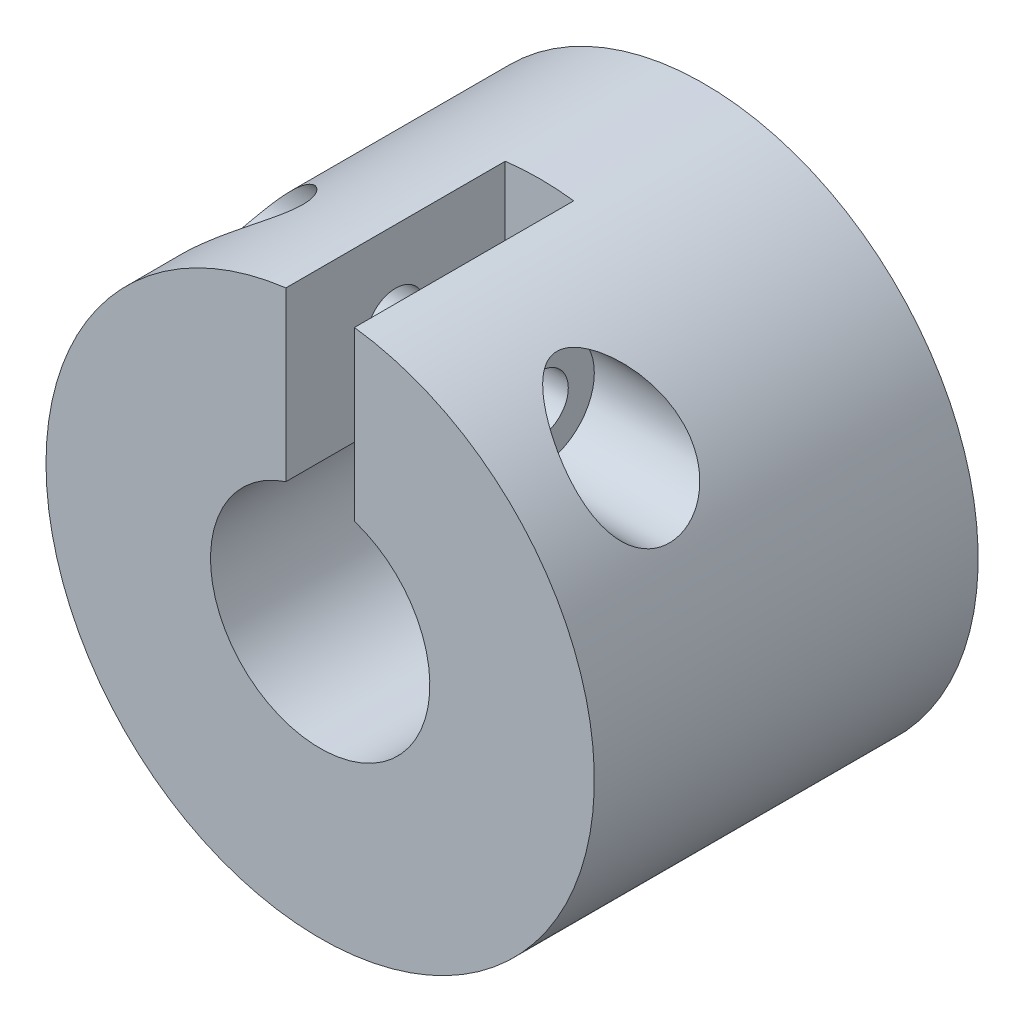
ISO-10303-21;
HEADER;
FILE_DESCRIPTION(('STEP AP214'),'2;1');
FILE_NAME('part.step','',(''),(''),'','','');
FILE_SCHEMA(('AUTOMOTIVE_DESIGN { 1 0 10303 214 1 1 1 1 }'));
ENDSEC;
DATA;
#1=APPLICATION_CONTEXT('core data for automotive mechanical design processes');
#2=APPLICATION_PROTOCOL_DEFINITION('international standard','automotive_design',2000,#1);
#3=PRODUCT_CONTEXT('',#1,'mechanical');
#4=PRODUCT('Part','Part','',(#3));
#5=PRODUCT_RELATED_PRODUCT_CATEGORY('part','',(#4));
#6=PRODUCT_DEFINITION_FORMATION('','',#4);
#7=PRODUCT_DEFINITION_CONTEXT('part definition',#1,'design');
#8=PRODUCT_DEFINITION('design','',#6,#7);
#9=PRODUCT_DEFINITION_SHAPE('','',#8);
#10=(LENGTH_UNIT() NAMED_UNIT(*) SI_UNIT(.MILLI.,.METRE.));
#11=(NAMED_UNIT(*) PLANE_ANGLE_UNIT() SI_UNIT($,.RADIAN.));
#12=(NAMED_UNIT(*) SI_UNIT($,.STERADIAN.) SOLID_ANGLE_UNIT());
#13=UNCERTAINTY_MEASURE_WITH_UNIT(LENGTH_MEASURE(1.E-05),#10,'distance_accuracy_value','');
#14=(GEOMETRIC_REPRESENTATION_CONTEXT(3) GLOBAL_UNCERTAINTY_ASSIGNED_CONTEXT((#13)) GLOBAL_UNIT_ASSIGNED_CONTEXT((#10,
#11,#12)) REPRESENTATION_CONTEXT('',''));
#15=CARTESIAN_POINT('',(0.,0.,0.));
#16=DIRECTION('',(0.,0.,1.));
#17=DIRECTION('',(1.,0.,0.));
#18=AXIS2_PLACEMENT_3D('',#15,#16,#17);
#19=CARTESIAN_POINT('',(0.,0.,8.));
#20=DIRECTION('',(0.,0.,-1.));
#21=DIRECTION('',(-1.,0.,0.));
#22=AXIS2_PLACEMENT_3D('',#19,#20,#21);
#23=CYLINDRICAL_SURFACE('',#22,10.);
#24=CARTESIAN_POINT('',(0.,0.,8.));
#25=DIRECTION('',(0.,0.,1.));
#26=DIRECTION('',(1.,0.,0.));
#27=AXIS2_PLACEMENT_3D('',#24,#25,#26);
#28=CIRCLE('',#27,10.);
#29=CARTESIAN_POINT('',(-1.25,9.92156741649221,8.));
#30=VERTEX_POINT('',#29);
#31=CARTESIAN_POINT('',(1.25,9.92156741649221,8.));
#32=VERTEX_POINT('',#31);
#33=EDGE_CURVE('E123',#30,#32,#28,.T.);
#34=ORIENTED_EDGE('',*,*,#33,.F.);
#35=DIRECTION('',(0.,0.,-1.));
#36=VECTOR('',#35,1.);
#37=CARTESIAN_POINT('',(-1.25,9.92156741649221,8.));
#38=LINE('',#37,#36);
#39=CARTESIAN_POINT('',(-1.25,9.92156741649221,0.));
#40=VERTEX_POINT('',#39);
#41=EDGE_CURVE('E85',#30,#40,#38,.T.);
#42=ORIENTED_EDGE('',*,*,#41,.T.);
#43=CARTESIAN_POINT('',(0.,0.,0.));
#44=DIRECTION('',(0.,0.,-1.));
#45=DIRECTION('',(-1.,0.,0.));
#46=AXIS2_PLACEMENT_3D('',#43,#44,#45);
#47=CIRCLE('',#46,10.);
#48=CARTESIAN_POINT('',(1.25,9.92156741649221,0.));
#49=VERTEX_POINT('',#48);
#50=EDGE_CURVE('E92',#40,#49,#47,.T.);
#51=ORIENTED_EDGE('',*,*,#50,.T.);
#52=DIRECTION('',(0.,0.,-1.));
#53=VECTOR('',#52,1.);
#54=CARTESIAN_POINT('',(1.25,9.92156741649221,8.));
#55=LINE('',#54,#53);
#56=EDGE_CURVE('E77',#49,#32,#55,.F.);
#57=ORIENTED_EDGE('',*,*,#56,.T.);
#58=EDGE_LOOP('',(#34,#42,#51,#57));
#59=FACE_BOUND('',#58,.T.);
#60=CARTESIAN_POINT('',(-7.27543152095098,6.86061922744244,6.));
#61=CARTESIAN_POINT('',(-7.39183216666685,6.73719001609119,5.99999880292958));
#62=CARTESIAN_POINT('',(-7.50505648529488,6.61078459610578,5.98860999962556));
#63=CARTESIAN_POINT('',(-7.72254321051827,6.35533309906759,5.93946749641221));
#64=CARTESIAN_POINT('',(-7.82681943364679,6.22629148839569,5.90175529543701));
#65=CARTESIAN_POINT('',(-8.00052633292854,6.00058287395714,5.80875583795577));
#66=CARTESIAN_POINT('',(-8.07243952590286,5.90332827451924,5.75954739046856));
#67=CARTESIAN_POINT('',(-8.20753974351116,5.71399822557016,5.64244533449945));
#68=CARTESIAN_POINT('',(-8.27072926490819,5.62192129867063,5.57455708899766));
#69=CARTESIAN_POINT('',(-8.38721839858168,5.44662787246044,5.41931003595386));
#70=CARTESIAN_POINT('',(-8.44043104736862,5.36349175571951,5.33179342106205));
#71=CARTESIAN_POINT('',(-8.5347366942598,5.21212548794851,5.13905001145749));
#72=CARTESIAN_POINT('',(-8.57583997831625,5.1438826990573,5.03383836732313));
#73=CARTESIAN_POINT('',(-8.63996394592979,5.03532039607679,4.82473340756291));
#74=CARTESIAN_POINT('',(-8.66470527480826,4.99243629036043,4.72269519029521));
#75=CARTESIAN_POINT('',(-8.70386555798854,4.92385067968516,4.51113795623102));
#76=CARTESIAN_POINT('',(-8.7182913728946,4.8981377553336,4.40162396459485));
#77=CARTESIAN_POINT('',(-8.73564183749775,4.86711803246507,4.19025966301935));
#78=CARTESIAN_POINT('',(-8.73958051168062,4.86001328420116,4.08875174061526));
#79=CARTESIAN_POINT('',(-8.73886217900801,4.86130561508796,3.88587988197227));
#80=CARTESIAN_POINT('',(-8.73420771331676,4.86969811139202,3.78451591203466));
#81=CARTESIAN_POINT('',(-8.71663850571998,4.90107295256313,3.58793652215147));
#82=CARTESIAN_POINT('',(-8.70397241014255,4.92361597145719,3.49262791507788));
#83=CARTESIAN_POINT('',(-8.67079643808582,4.98180716428413,3.30755816173122));
#84=CARTESIAN_POINT('',(-8.65028643315122,5.01745555283591,3.21779710633525));
#85=CARTESIAN_POINT('',(-8.60114356580542,5.1012481056407,3.04388518966525));
#86=CARTESIAN_POINT('',(-8.57232582614404,5.14967426722744,2.95992310357321));
#87=CARTESIAN_POINT('',(-8.50727352508103,5.25644345332605,2.80177965935134));
#88=CARTESIAN_POINT('',(-8.47103719894153,5.3147888368674,2.72760063533834));
#89=CARTESIAN_POINT('',(-8.38868662329482,5.44391659803161,2.58475176376587));
#90=CARTESIAN_POINT('',(-8.34202421011732,5.51531261986942,2.51695548977554));
#91=CARTESIAN_POINT('',(-8.2417066216192,5.66412706703188,2.39447541805159));
#92=CARTESIAN_POINT('',(-8.18804864450139,5.74154790032197,2.33979689917217));
#93=CARTESIAN_POINT('',(-8.06680793836133,5.91091158695257,2.23670798933786));
#94=CARTESIAN_POINT('',(-7.99832626083275,6.00337810261382,2.19022239691934));
#95=CARTESIAN_POINT('',(-7.8549069894382,6.18985754650653,2.11312946552314));
#96=CARTESIAN_POINT('',(-7.7799649618021,6.2838715003691,2.08253313422488));
#97=CARTESIAN_POINT('',(-7.58486284683145,6.51948296795391,2.02388701408774));
#98=CARTESIAN_POINT('',(-7.46130241506478,6.66063505810728,2.00527474144647));
#99=CARTESIAN_POINT('',(-7.20581814101485,6.93626074245709,1.99665832412566));
#100=CARTESIAN_POINT('',(-7.07387557741066,7.07071809856324,2.00672058882349));
#101=CARTESIAN_POINT('',(-6.85385424612593,7.28277898270894,2.04327386910868));
#102=CARTESIAN_POINT('',(-6.76725032482597,7.36329413775669,2.06247011589135));
#103=CARTESIAN_POINT('',(-6.59266712487456,7.52000542047024,2.11004846762096));
#104=CARTESIAN_POINT('',(-6.50468794735249,7.59620186382386,2.13842990013185));
#105=CARTESIAN_POINT('',(-6.32797219058987,7.7440339171993,2.20385938559858));
#106=CARTESIAN_POINT('',(-6.23923490022363,7.81566454799107,2.24091670102443));
#107=CARTESIAN_POINT('',(-6.06186839405526,7.95401705165172,2.323405682498));
#108=CARTESIAN_POINT('',(-5.97323915055741,8.02074071461028,2.36883427324147));
#109=CARTESIAN_POINT('',(-5.82093233316387,8.13160861110573,2.45466024584472));
#110=CARTESIAN_POINT('',(-5.75701280247679,8.17696518508571,2.49307549913814));
#111=CARTESIAN_POINT('',(-5.63018553203752,8.2648021802,2.57456666985809));
#112=CARTESIAN_POINT('',(-5.56727757162637,8.30728323525719,2.61764155456902));
#113=CARTESIAN_POINT('',(-5.44325193757311,8.38907085704258,2.7086555894336));
#114=CARTESIAN_POINT('',(-5.38212987099805,8.42838572126824,2.7565812296204));
#115=CARTESIAN_POINT('',(-5.26241494451332,8.50364503971121,2.857876321276));
#116=CARTESIAN_POINT('',(-5.20382037964374,8.53959178574889,2.91124201869281));
#117=CARTESIAN_POINT('',(-5.09135066981113,8.6071121034955,3.02328284781613));
#118=CARTESIAN_POINT('',(-5.03741528084065,8.63874614192877,3.08186002268785));
#119=CARTESIAN_POINT('',(-4.9352330074264,8.69752468407302,3.20596563770282));
#120=CARTESIAN_POINT('',(-4.88698449158852,8.72467047623227,3.27149207401285));
#121=CARTESIAN_POINT('',(-4.80778423369589,8.76851523101797,3.39711327154679));
#122=CARTESIAN_POINT('',(-4.77528846180273,8.7862191922746,3.45586381121272));
#123=CARTESIAN_POINT('',(-4.71874981195852,8.81671343947372,3.57850146569843));
#124=CARTESIAN_POINT('',(-4.69468828087458,8.82951457437493,3.6423768566815));
#125=CARTESIAN_POINT('',(-4.6619678195133,8.84682567363886,3.75980762148474));
#126=CARTESIAN_POINT('',(-4.65108903689967,8.85253783427644,3.81255701477843));
#127=CARTESIAN_POINT('',(-4.63741763866107,8.85970775261065,3.91937193645345));
#128=CARTESIAN_POINT('',(-4.63461758699835,8.86116942266524,3.97343620829709));
#129=CARTESIAN_POINT('',(-4.63743630798052,8.85969445490552,4.08130390673292));
#130=CARTESIAN_POINT('',(-4.64305939651356,8.85675556231055,4.13510718542262));
#131=CARTESIAN_POINT('',(-4.66206068618562,8.84676782251377,4.24093371112833));
#132=CARTESIAN_POINT('',(-4.67544707237924,8.83971463745632,4.29295501796186));
#133=CARTESIAN_POINT('',(-4.7148687344645,8.81876812838903,4.41307166023));
#134=CARTESIAN_POINT('',(-4.74375748398599,8.80330599591419,4.47994299706321));
#135=CARTESIAN_POINT('',(-4.81014469132421,8.76720774712063,4.60775176506861));
#136=CARTESIAN_POINT('',(-4.84766552532873,8.74655817083267,4.66867317770388));
#137=CARTESIAN_POINT('',(-4.9227311016886,8.70449887180195,4.77650297520663));
#138=CARTESIAN_POINT('',(-4.95950596515958,8.68361961513199,4.82416969561761));
#139=CARTESIAN_POINT('',(-5.03616229613354,8.63938866945012,4.91573090318414));
#140=CARTESIAN_POINT('',(-5.07604604330404,8.61603516153705,4.95962257162841));
#141=CARTESIAN_POINT('',(-5.19917382986714,8.54269707640285,5.08636442314892));
#142=CARTESIAN_POINT('',(-5.28576966482311,8.48950374398807,5.16411426569945));
#143=CARTESIAN_POINT('',(-5.45270465371394,8.38311656890292,5.29940439840398));
#144=CARTESIAN_POINT('',(-5.53252097610051,8.33071212099053,5.35825279372511));
#145=CARTESIAN_POINT('',(-5.69425819950565,8.22100770903411,5.46811858769752));
#146=CARTESIAN_POINT('',(-5.776180521172,8.16370437633948,5.51913052919628));
#147=CARTESIAN_POINT('',(-5.94101681247281,8.04454311223088,5.61372536677045));
#148=CARTESIAN_POINT('',(-6.02393107351422,7.98268381342834,5.65730601936481));
#149=CARTESIAN_POINT('',(-6.18998066254687,7.85462530485055,5.73713722662758));
#150=CARTESIAN_POINT('',(-6.27311605038944,7.78842477364789,5.77338553556152));
#151=CARTESIAN_POINT('',(-6.43482067892143,7.65529154330261,5.83675082282698));
#152=CARTESIAN_POINT('',(-6.51341128564333,7.58855918811224,5.8642324194556));
#153=CARTESIAN_POINT('',(-6.66969436793238,7.4515779572562,5.91207612815487));
#154=CARTESIAN_POINT('',(-6.74738654495358,7.38132795180029,5.93243593588216));
#155=CARTESIAN_POINT('',(-6.97815392381971,7.16584749710413,5.98205427770373));
#156=CARTESIAN_POINT('',(-7.1292959276183,7.01557885781622,6.0000015028662));
#157=CARTESIAN_POINT('',(-7.27543152095098,6.86061922744244,6.));
#158=B_SPLINE_CURVE_WITH_KNOTS('',3,(#60,#61,#62,#63,#64,#65,#66,#67,#68,#69,#70,#71,#72,#73,
#74,#75,#76,#77,#78,#79,#80,#81,#82,#83,#84,#85,#86,#87,#88,#89,#90,#91,#92,#93,#94,#95,#96,#97,
#98,#99,#100,#101,#102,#103,#104,#105,#106,#107,#108,#109,#110,#111,#112,#113,#114,#115,#116,
#117,#118,#119,#120,#121,#122,#123,#124,#125,#126,#127,#128,#129,#130,#131,#132,#133,#134,#135,
#136,#137,#138,#139,#140,#141,#142,#143,#144,#145,#146,#147,#148,#149,#150,#151,#152,#153,#154,
#155,#156,#157),.UNSPECIFIED.,.T.,.F.,(4,2,2,2,2,2,2,2,2,2,2,2,2,2,2,2,2,2,2,2,2,2,2,2,2,2,2,2,
2,2,2,2,2,2,2,2,2,2,2,2,2,2,2,2,2,2,2,2,4),(0.,0.508402815212956,1.01600593644292,
1.40625688016514,1.79639589932578,2.18979176005942,2.5828524920917,2.92119971073322,
3.2593216928226,3.56331049974366,3.86720942546145,4.16211066100965,4.45701672619638,
4.75907257224348,5.06120035518265,5.38676212684573,5.71245469231621,6.08337428835854,
6.45455050649949,7.01700378322203,7.58076074295556,7.93974952649931,8.29871203486195,
8.65805953741822,9.01727529090553,9.27897388033132,9.54061458778853,9.80154566069195,
10.0622978748824,10.3189024375739,10.575433207986,10.7830819344418,10.9902684845688,
11.1520514313027,11.3136854179468,11.4754022517058,11.6372898986697,11.8594327901584,
12.082158143971,12.2730504173388,12.4640840084327,12.8468033295066,13.1829016265545,
13.5192329250974,13.8556655818437,14.1922011249618,14.5119908917459,14.8318840349817,
15.470160108076),.UNSPECIFIED.);
#159=CARTESIAN_POINT('',(-7.27543152095098,6.86061922744244,6.));
#160=VERTEX_POINT('',#159);
#161=EDGE_CURVE('E129',#160,#160,#158,.T.);
#162=ORIENTED_EDGE('',*,*,#161,.T.);
#163=EDGE_LOOP('',(#162));
#164=FACE_BOUND('',#163,.T.);
#165=CARTESIAN_POINT('',(7.27543152095098,6.86061922744244,2.));
#166=CARTESIAN_POINT('',(7.19973494617591,6.94089639404656,2.00000134650425));
#167=CARTESIAN_POINT('',(7.12274072780046,7.01987603436354,2.00482630472186));
#168=CARTESIAN_POINT('',(6.96671784168169,7.17474115731961,2.02328339309686));
#169=CARTESIAN_POINT('',(6.8876891420166,7.25062659136112,2.03691566152522));
#170=CARTESIAN_POINT('',(6.72799032223454,7.39905848508546,2.07232773928204));
#171=CARTESIAN_POINT('',(6.64731667335451,7.47159636299777,2.09412731015141));
#172=CARTESIAN_POINT('',(6.48507049540748,7.61284619383213,2.14533089686928));
#173=CARTESIAN_POINT('',(6.40349809468315,7.68155868475384,2.17473384008489));
#174=CARTESIAN_POINT('',(6.23822794339106,7.81640143925017,2.24151633762111));
#175=CARTESIAN_POINT('',(6.15452248769714,7.8824432993419,2.27905515465465));
#176=CARTESIAN_POINT('',(5.98741677063869,8.01011190896215,2.36157235039098));
#177=CARTESIAN_POINT('',(5.90401649002242,8.07173894171743,2.40655025123665));
#178=CARTESIAN_POINT('',(5.73863878146853,8.19013605383186,2.50392453879768));
#179=CARTESIAN_POINT('',(5.65665735758223,8.24692257677824,2.5562940614693));
#180=CARTESIAN_POINT('',(5.49500028866592,8.35550290189973,2.66904175588181));
#181=CARTESIAN_POINT('',(5.41532270025797,8.40730100340739,2.72941292269848));
#182=CARTESIAN_POINT('',(5.27412651078103,8.4964250092309,2.84736749548459));
#183=CARTESIAN_POINT('',(5.21194403056898,8.53466835861574,2.90345532812448));
#184=CARTESIAN_POINT('',(5.09168599161189,8.60695374511315,3.02266528550804));
#185=CARTESIAN_POINT('',(5.03361718166699,8.64098894360833,3.08579855104407));
#186=CARTESIAN_POINT('',(4.92350296168051,8.7042051684188,3.22099539638004));
#187=CARTESIAN_POINT('',(4.87154312548135,8.73331927782759,3.29316192559384));
#188=CARTESIAN_POINT('',(4.77904872627515,8.78427407702013,3.44680235721327));
#189=CARTESIAN_POINT('',(4.73846474332665,8.80614630516552,3.52823376979113));
#190=CARTESIAN_POINT('',(4.68800483308607,8.83306745625777,3.66509601239881));
#191=CARTESIAN_POINT('',(4.6723469440356,8.84134304089603,3.7177375479662));
#192=CARTESIAN_POINT('',(4.64889327304269,8.85369809517565,3.82521510174499));
#193=CARTESIAN_POINT('',(4.64108693971214,8.85778319638551,3.88004807160003));
#194=CARTESIAN_POINT('',(4.63424486925248,8.86136519921055,3.99066104365043));
#195=CARTESIAN_POINT('',(4.63524622204878,8.86084269779024,4.04644406248887));
#196=CARTESIAN_POINT('',(4.64597430494869,8.85522191944402,4.15693721983275));
#197=CARTESIAN_POINT('',(4.65570853766152,8.85011970798654,4.21164639446758));
#198=CARTESIAN_POINT('',(4.68570897413174,8.83427813350283,4.33011424350322));
#199=CARTESIAN_POINT('',(4.7077977930397,8.82255817993973,4.39327078156419));
#200=CARTESIAN_POINT('',(4.76046194907201,8.79425360477145,4.51475373129939));
#201=CARTESIAN_POINT('',(4.7910556420502,8.77765845671067,4.57306933735816));
#202=CARTESIAN_POINT('',(4.87932763988737,8.72903247808798,4.71988657841276));
#203=CARTESIAN_POINT('',(4.94194447912354,8.69385525519776,4.80432755723853));
#204=CARTESIAN_POINT('',(5.07605999401013,8.6162454589532,4.96204380192169));
#205=CARTESIAN_POINT('',(5.14758500115424,8.5737912294769,5.03528446810437));
#206=CARTESIAN_POINT('',(5.28935898222001,8.48698991718398,5.16642127982726));
#207=CARTESIAN_POINT('',(5.35918976650726,8.44311871839884,5.22509509861754));
#208=CARTESIAN_POINT('',(5.50149755652881,8.35109072666784,5.33553945102264));
#209=CARTESIAN_POINT('',(5.5739765671316,8.30293064540193,5.38730461040353));
#210=CARTESIAN_POINT('',(5.72052160227552,8.20265359491962,5.4845273038937));
#211=CARTESIAN_POINT('',(5.79458905736133,8.15053294133597,5.52997885075874));
#212=CARTESIAN_POINT('',(5.94349823363413,8.04259235159119,5.61482248841806));
#213=CARTESIAN_POINT('',(6.01834005623065,7.98677192560595,5.65421377457401));
#214=CARTESIAN_POINT('',(6.17328131388875,7.86770402667346,5.72947041906073));
#215=CARTESIAN_POINT('',(6.25339472531127,7.8042095579694,5.76491845691361));
#216=CARTESIAN_POINT('',(6.41324938940109,7.67339125358168,5.82885272008774));
#217=CARTESIAN_POINT('',(6.49299058335808,7.60606683450334,5.85733788127419));
#218=CARTESIAN_POINT('',(6.73069324776324,7.39876528261943,5.93182682789668));
#219=CARTESIAN_POINT('',(6.88746146556546,7.25320998093408,5.96702332102869));
#220=CARTESIAN_POINT('',(7.16643347303473,6.97666718835129,6.0005960096058));
#221=CARTESIAN_POINT('',(7.28988851182624,6.84758168564246,6.00433363332952));
#222=CARTESIAN_POINT('',(7.5288086773591,6.58395635162127,5.98516179546582));
#223=CARTESIAN_POINT('',(7.64428291027328,6.44942302401222,5.96228325328596));
#224=CARTESIAN_POINT('',(7.84034628869166,6.20868105244667,5.89396448657287));
#225=CARTESIAN_POINT('',(7.92310797971224,6.10258127208799,5.85441043320633));
#226=CARTESIAN_POINT('',(8.07974264304064,5.89361696459721,5.7545002529879));
#227=CARTESIAN_POINT('',(8.15362623210733,5.79074868412124,5.69416931265917));
#228=CARTESIAN_POINT('',(8.27935194292479,5.60914565255099,5.56339929086252));
#229=CARTESIAN_POINT('',(8.33282412508591,5.52920879254374,5.49620616738128));
#230=CARTESIAN_POINT('',(8.43100063650305,5.37831977123645,5.34686200966629));
#231=CARTESIAN_POINT('',(8.47570710836021,5.30736541585057,5.26471464018713));
#232=CARTESIAN_POINT('',(8.55554984766568,5.1776852273619,5.08626149638483));
#233=CARTESIAN_POINT('',(8.59062922110976,5.11903255509662,4.98987652005452));
#234=CARTESIAN_POINT('',(8.65004722647389,5.01798256773568,4.785888984057));
#235=CARTESIAN_POINT('',(8.67439083259196,4.97557772573768,4.67829164803689));
#236=CARTESIAN_POINT('',(8.70981870359365,4.91326823466883,4.46753480738909));
#237=CARTESIAN_POINT('',(8.72204263312255,4.89144218329083,4.36513147132059));
#238=CARTESIAN_POINT('',(8.7373282060461,4.86408803950904,4.1575139431933));
#239=CARTESIAN_POINT('',(8.74039366173453,4.85855316577617,4.0523009390892));
#240=CARTESIAN_POINT('',(8.73741104926838,4.86391276022498,3.84843847330011));
#241=CARTESIAN_POINT('',(8.73187079158325,4.8738918044999,3.74975567690969));
#242=CARTESIAN_POINT('',(8.71268640546057,4.90810309597151,3.55572274701593));
#243=CARTESIAN_POINT('',(8.69904317695288,4.93233376035589,3.46037224466728));
#244=CARTESIAN_POINT('',(8.66382320325317,4.99393799843333,3.2754174055914));
#245=CARTESIAN_POINT('',(8.64223389461463,5.03133238101358,3.18582243378524));
#246=CARTESIAN_POINT('',(8.5914620609028,5.11754557325607,3.01466639493512));
#247=CARTESIAN_POINT('',(8.5622783959149,5.16636609787406,2.93310653649926));
#248=CARTESIAN_POINT('',(8.49504787777861,5.2762212216001,2.77550273800899));
#249=CARTESIAN_POINT('',(8.45661217054361,5.33776734941989,2.69998290441297));
#250=CARTESIAN_POINT('',(8.37255253262745,5.46867588617348,2.56067979636582));
#251=CARTESIAN_POINT('',(8.32692637493193,5.53804071480068,2.49690017138498));
#252=CARTESIAN_POINT('',(8.22387347363737,5.69009857252572,2.37507159444505));
#253=CARTESIAN_POINT('',(8.16569941604283,5.77341686558271,2.31843995453477));
#254=CARTESIAN_POINT('',(8.04263396162134,5.94366165990226,2.21986349552312));
#255=CARTESIAN_POINT('',(7.97773800953098,6.03059058378657,2.17792872161239));
#256=CARTESIAN_POINT('',(7.81373513329744,6.24261157391363,2.09316111140346));
#257=CARTESIAN_POINT('',(7.71175058552018,6.36832359697195,2.05742135772287));
#258=CARTESIAN_POINT('',(7.49930076433551,6.61720362265489,2.01081960395504));
#259=CARTESIAN_POINT('',(7.38882202522537,6.74036717601199,1.99999798298936));
#260=CARTESIAN_POINT('',(7.27543152095098,6.86061922744244,2.));
#261=B_SPLINE_CURVE_WITH_KNOTS('',3,(#165,#166,#167,#168,#169,#170,#171,#172,#173,#174,#175,
#176,#177,#178,#179,#180,#181,#182,#183,#184,#185,#186,#187,#188,#189,#190,#191,#192,#193,#194,
#195,#196,#197,#198,#199,#200,#201,#202,#203,#204,#205,#206,#207,#208,#209,#210,#211,#212,#213,
#214,#215,#216,#217,#218,#219,#220,#221,#222,#223,#224,#225,#226,#227,#228,#229,#230,#231,#232,
#233,#234,#235,#236,#237,#238,#239,#240,#241,#242,#243,#244,#245,#246,#247,#248,#249,#250,#251,
#252,#253,#254,#255,#256,#257,#258,#259,#260),.UNSPECIFIED.,.T.,.F.,(4,2,2,2,2,2,2,2,2,2,2,2,2,
2,2,2,2,2,2,2,2,2,2,2,2,2,2,2,2,2,2,2,2,2,2,2,2,2,2,2,2,2,2,2,2,2,2,4),(0.,0.330820714819017,
0.66164662350692,0.993278220501636,1.32486305862882,1.66364406982851,2.00240332753086,
2.33996167171592,2.67722643345081,2.95305259220192,3.22932126027546,3.50908787996453,
3.78761958072106,3.95360613685957,4.11936933113854,4.28583090162757,4.45243562000987,
4.65507621698901,4.85815760969087,5.18886245240262,5.52056911329618,5.8237812246794,
6.12722784627379,6.43096029216258,6.73473303074766,7.05900506354794,7.38332662382546,
8.03065680036246,8.56481595695254,9.09835521184058,9.51754847812719,9.93623536098249,
10.2867410086832,10.6371608752493,10.9896091092889,11.3418938716486,11.6565005698093,
11.9709762919583,12.2675879198931,12.5641666117893,12.861216249101,13.158310499375,
13.4712065136753,13.7841996287564,14.131862200882,14.4797619362944,14.9745172358437,
15.4700737096895),.UNSPECIFIED.);
#262=CARTESIAN_POINT('',(7.27543152095098,6.86061922744244,2.));
#263=VERTEX_POINT('',#262);
#264=EDGE_CURVE('E37',#263,#263,#261,.T.);
#265=ORIENTED_EDGE('',*,*,#264,.F.);
#266=EDGE_LOOP('',(#265));
#267=FACE_BOUND('',#266,.T.);
#268=CARTESIAN_POINT('',(0.,0.,-6.));
#269=DIRECTION('',(0.,0.,-1.));
#270=DIRECTION('',(-1.,0.,0.));
#271=AXIS2_PLACEMENT_3D('',#268,#269,#270);
#272=CIRCLE('',#271,10.);
#273=CARTESIAN_POINT('',(-10.,0.,-6.));
#274=VERTEX_POINT('',#273);
#275=EDGE_CURVE('E99',#274,#274,#272,.T.);
#276=ORIENTED_EDGE('',*,*,#275,.F.);
#277=EDGE_LOOP('',(#276));
#278=FACE_BOUND('',#277,.T.);
#279=ADVANCED_FACE('F33',(#59,#164,#267,#278),#23,.T.);
#280=CARTESIAN_POINT('',(10.,6.86061922744244,4.));
#281=DIRECTION('',(-1.,0.,0.));
#282=DIRECTION('',(0.,0.,1.));
#283=AXIS2_PLACEMENT_3D('',#280,#281,#282);
#284=CYLINDRICAL_SURFACE('',#283,1.05);
#285=CARTESIAN_POINT('',(1.25,6.86061922744244,4.));
#286=DIRECTION('',(1.,0.,0.));
#287=DIRECTION('',(0.,0.,-1.));
#288=AXIS2_PLACEMENT_3D('',#285,#286,#287);
#289=CIRCLE('',#288,1.05);
#290=CARTESIAN_POINT('',(1.25,6.86061922744244,2.95));
#291=VERTEX_POINT('',#290);
#292=EDGE_CURVE('E112',#291,#291,#289,.T.);
#293=ORIENTED_EDGE('',*,*,#292,.F.);
#294=EDGE_LOOP('',(#293));
#295=FACE_BOUND('',#294,.T.);
#296=CARTESIAN_POINT('',(4.,6.86061922744244,4.));
#297=DIRECTION('',(1.,0.,0.));
#298=DIRECTION('',(0.,0.,-1.));
#299=AXIS2_PLACEMENT_3D('',#296,#297,#298);
#300=CIRCLE('',#299,1.05);
#301=CARTESIAN_POINT('',(4.,6.86061922744244,2.95));
#302=VERTEX_POINT('',#301);
#303=EDGE_CURVE('E107',#302,#302,#300,.F.);
#304=ORIENTED_EDGE('',*,*,#303,.F.);
#305=EDGE_LOOP('',(#304));
#306=FACE_BOUND('',#305,.T.);
#307=ADVANCED_FACE('F145',(#295,#306),#284,.F.);
#308=CARTESIAN_POINT('',(-1.25,6.86061922744244,4.));
#309=DIRECTION('',(-1.,0.,0.));
#310=DIRECTION('',(0.,0.,1.));
#311=AXIS2_PLACEMENT_3D('',#308,#309,#310);
#312=CIRCLE('',#311,1.05);
#313=CARTESIAN_POINT('',(-1.25,6.86061922744244,5.05));
#314=VERTEX_POINT('',#313);
#315=EDGE_CURVE('E115',#314,#314,#312,.T.);
#316=ORIENTED_EDGE('',*,*,#315,.F.);
#317=EDGE_LOOP('',(#316));
#318=FACE_BOUND('',#317,.T.);
#319=CARTESIAN_POINT('',(-4.,6.86061922744244,4.));
#320=DIRECTION('',(-1.,0.,0.));
#321=DIRECTION('',(0.,0.,1.));
#322=AXIS2_PLACEMENT_3D('',#319,#320,#321);
#323=CIRCLE('',#322,1.05);
#324=CARTESIAN_POINT('',(-4.,6.86061922744244,5.05));
#325=VERTEX_POINT('',#324);
#326=EDGE_CURVE('E111',#325,#325,#323,.F.);
#327=ORIENTED_EDGE('',*,*,#326,.F.);
#328=EDGE_LOOP('',(#327));
#329=FACE_BOUND('',#328,.T.);
#330=ADVANCED_FACE('F148',(#318,#329),#284,.F.);
#331=CARTESIAN_POINT('',(0.,0.,8.));
#332=DIRECTION('',(0.,0.,1.));
#333=DIRECTION('',(1.,0.,0.));
#334=AXIS2_PLACEMENT_3D('',#331,#332,#333);
#335=PLANE('',#334);
#336=DIRECTION('',(0.,-1.,0.));
#337=VECTOR('',#336,1.);
#338=CARTESIAN_POINT('',(-1.25,0.,8.));
#339=LINE('',#338,#337);
#340=CARTESIAN_POINT('',(-1.25,3.79967103839267,8.));
#341=VERTEX_POINT('',#340);
#342=EDGE_CURVE('E61',#30,#341,#339,.T.);
#343=ORIENTED_EDGE('',*,*,#342,.F.);
#344=ORIENTED_EDGE('',*,*,#33,.T.);
#345=DIRECTION('',(0.,1.,0.));
#346=VECTOR('',#345,1.);
#347=CARTESIAN_POINT('',(1.25,0.,8.));
#348=LINE('',#347,#346);
#349=CARTESIAN_POINT('',(1.25,3.79967103839267,8.));
#350=VERTEX_POINT('',#349);
#351=EDGE_CURVE('E80',#350,#32,#348,.T.);
#352=ORIENTED_EDGE('',*,*,#351,.F.);
#353=CARTESIAN_POINT('',(0.,0.,8.));
#354=DIRECTION('',(0.,0.,1.));
#355=DIRECTION('',(1.,0.,0.));
#356=AXIS2_PLACEMENT_3D('',#353,#354,#355);
#357=CIRCLE('',#356,4.);
#358=EDGE_CURVE('E120',#341,#350,#357,.T.);
#359=ORIENTED_EDGE('',*,*,#358,.F.);
#360=EDGE_LOOP('',(#343,#344,#352,#359));
#361=FACE_BOUND('',#360,.T.);
#362=ADVANCED_FACE('F158',(#361),#335,.T.);
#363=CARTESIAN_POINT('',(0.,0.,8.));
#364=DIRECTION('',(0.,0.,-1.));
#365=DIRECTION('',(-1.,0.,0.));
#366=AXIS2_PLACEMENT_3D('',#363,#364,#365);
#367=CYLINDRICAL_SURFACE('',#366,4.);
#368=DIRECTION('',(0.,0.,-1.));
#369=VECTOR('',#368,1.);
#370=CARTESIAN_POINT('',(-1.25,3.79967103839267,8.));
#371=LINE('',#370,#369);
#372=CARTESIAN_POINT('',(-1.25,3.79967103839267,0.));
#373=VERTEX_POINT('',#372);
#374=EDGE_CURVE('E11',#341,#373,#371,.T.);
#375=ORIENTED_EDGE('',*,*,#374,.F.);
#376=ORIENTED_EDGE('',*,*,#358,.T.);
#377=DIRECTION('',(0.,0.,-1.));
#378=VECTOR('',#377,1.);
#379=CARTESIAN_POINT('',(1.25,3.79967103839267,8.));
#380=LINE('',#379,#378);
#381=CARTESIAN_POINT('',(1.25,3.79967103839267,0.));
#382=VERTEX_POINT('',#381);
#383=EDGE_CURVE('E46',#382,#350,#380,.F.);
#384=ORIENTED_EDGE('',*,*,#383,.F.);
#385=CARTESIAN_POINT('',(0.,0.,0.));
#386=DIRECTION('',(0.,0.,1.));
#387=DIRECTION('',(1.,0.,0.));
#388=AXIS2_PLACEMENT_3D('',#385,#386,#387);
#389=CIRCLE('',#388,4.);
#390=EDGE_CURVE('E94',#373,#382,#389,.T.);
#391=ORIENTED_EDGE('',*,*,#390,.F.);
#392=EDGE_LOOP('',(#375,#376,#384,#391));
#393=FACE_BOUND('',#392,.T.);
#394=ADVANCED_FACE('F152',(#393),#367,.F.);
#395=CARTESIAN_POINT('',(1.25,0.,0.));
#396=DIRECTION('',(1.,0.,0.));
#397=DIRECTION('',(0.,0.,-1.));
#398=AXIS2_PLACEMENT_3D('',#395,#396,#397);
#399=PLANE('',#398);
#400=ORIENTED_EDGE('',*,*,#292,.T.);
#401=EDGE_LOOP('',(#400));
#402=FACE_BOUND('',#401,.T.);
#403=DIRECTION('',(0.,1.,0.));
#404=VECTOR('',#403,1.);
#405=CARTESIAN_POINT('',(1.25,0.,0.));
#406=LINE('',#405,#404);
#407=EDGE_CURVE('E54',#382,#49,#406,.T.);
#408=ORIENTED_EDGE('',*,*,#407,.F.);
#409=ORIENTED_EDGE('',*,*,#383,.T.);
#410=ORIENTED_EDGE('',*,*,#351,.T.);
#411=ORIENTED_EDGE('',*,*,#56,.F.);
#412=EDGE_LOOP('',(#408,#409,#410,#411));
#413=FACE_BOUND('',#412,.T.);
#414=ADVANCED_FACE('F78',(#402,#413),#399,.F.);
#415=CARTESIAN_POINT('',(-1.25,0.,0.));
#416=DIRECTION('',(-1.,0.,0.));
#417=DIRECTION('',(0.,0.,1.));
#418=AXIS2_PLACEMENT_3D('',#415,#416,#417);
#419=PLANE('',#418);
#420=ORIENTED_EDGE('',*,*,#315,.T.);
#421=EDGE_LOOP('',(#420));
#422=FACE_BOUND('',#421,.T.);
#423=ORIENTED_EDGE('',*,*,#342,.T.);
#424=ORIENTED_EDGE('',*,*,#374,.T.);
#425=DIRECTION('',(0.,-1.,0.));
#426=VECTOR('',#425,1.);
#427=CARTESIAN_POINT('',(-1.25,0.,0.));
#428=LINE('',#427,#426);
#429=EDGE_CURVE('E95',#40,#373,#428,.T.);
#430=ORIENTED_EDGE('',*,*,#429,.F.);
#431=ORIENTED_EDGE('',*,*,#41,.F.);
#432=EDGE_LOOP('',(#423,#424,#430,#431));
#433=FACE_BOUND('',#432,.T.);
#434=ADVANCED_FACE('F143',(#422,#433),#419,.F.);
#435=CARTESIAN_POINT('',(-4.,6.86061922744244,4.));
#436=DIRECTION('',(-1.,0.,0.));
#437=DIRECTION('',(0.,0.,1.));
#438=AXIS2_PLACEMENT_3D('',#435,#436,#437);
#439=CYLINDRICAL_SURFACE('',#438,2.);
#440=CARTESIAN_POINT('',(-4.,6.86061922744244,4.));
#441=DIRECTION('',(-1.,0.,0.));
#442=DIRECTION('',(0.,0.,1.));
#443=AXIS2_PLACEMENT_3D('',#440,#441,#442);
#444=CIRCLE('',#443,2.);
#445=CARTESIAN_POINT('',(-4.,6.86061922744244,6.));
#446=VERTEX_POINT('',#445);
#447=EDGE_CURVE('E108',#446,#446,#444,.T.);
#448=ORIENTED_EDGE('',*,*,#447,.F.);
#449=EDGE_LOOP('',(#448));
#450=FACE_BOUND('',#449,.T.);
#451=ORIENTED_EDGE('',*,*,#161,.F.);
#452=EDGE_LOOP('',(#451));
#453=FACE_BOUND('',#452,.T.);
#454=ADVANCED_FACE('F137',(#450,#453),#439,.F.);
#455=CARTESIAN_POINT('',(-4.,6.86061922744244,4.));
#456=DIRECTION('',(-1.,0.,0.));
#457=DIRECTION('',(0.,0.,1.));
#458=AXIS2_PLACEMENT_3D('',#455,#456,#457);
#459=PLANE('',#458);
#460=ORIENTED_EDGE('',*,*,#447,.T.);
#461=EDGE_LOOP('',(#460));
#462=FACE_BOUND('',#461,.T.);
#463=ORIENTED_EDGE('',*,*,#326,.T.);
#464=EDGE_LOOP('',(#463));
#465=FACE_BOUND('',#464,.T.);
#466=ADVANCED_FACE('F142',(#462,#465),#459,.T.);
#467=CARTESIAN_POINT('',(4.,6.86061922744244,4.));
#468=DIRECTION('',(1.,0.,0.));
#469=DIRECTION('',(0.,0.,-1.));
#470=AXIS2_PLACEMENT_3D('',#467,#468,#469);
#471=CYLINDRICAL_SURFACE('',#470,2.);
#472=CARTESIAN_POINT('',(4.,6.86061922744244,4.));
#473=DIRECTION('',(-1.,0.,0.));
#474=DIRECTION('',(0.,0.,1.));
#475=AXIS2_PLACEMENT_3D('',#472,#473,#474);
#476=CIRCLE('',#475,2.);
#477=CARTESIAN_POINT('',(4.,6.86061922744244,6.));
#478=VERTEX_POINT('',#477);
#479=EDGE_CURVE('E102',#478,#478,#476,.T.);
#480=ORIENTED_EDGE('',*,*,#479,.T.);
#481=EDGE_LOOP('',(#480));
#482=FACE_BOUND('',#481,.T.);
#483=ORIENTED_EDGE('',*,*,#264,.T.);
#484=EDGE_LOOP('',(#483));
#485=FACE_BOUND('',#484,.T.);
#486=ADVANCED_FACE('F197',(#482,#485),#471,.F.);
#487=CARTESIAN_POINT('',(4.,6.86061922744244,4.));
#488=DIRECTION('',(1.,0.,0.));
#489=DIRECTION('',(0.,0.,1.));
#490=AXIS2_PLACEMENT_3D('',#487,#488,#489);
#491=PLANE('',#490);
#492=ORIENTED_EDGE('',*,*,#479,.F.);
#493=EDGE_LOOP('',(#492));
#494=FACE_BOUND('',#493,.T.);
#495=ORIENTED_EDGE('',*,*,#303,.T.);
#496=EDGE_LOOP('',(#495));
#497=FACE_BOUND('',#496,.T.);
#498=ADVANCED_FACE('F205',(#494,#497),#491,.T.);
#499=CARTESIAN_POINT('',(0.,0.,0.));
#500=DIRECTION('',(0.,0.,-1.));
#501=DIRECTION('',(-1.,0.,0.));
#502=AXIS2_PLACEMENT_3D('',#499,#500,#501);
#503=PLANE('',#502);
#504=ORIENTED_EDGE('',*,*,#50,.F.);
#505=ORIENTED_EDGE('',*,*,#429,.T.);
#506=ORIENTED_EDGE('',*,*,#390,.T.);
#507=ORIENTED_EDGE('',*,*,#407,.T.);
#508=EDGE_LOOP('',(#504,#505,#506,#507));
#509=FACE_BOUND('',#508,.T.);
#510=ADVANCED_FACE('F90',(#509),#503,.F.);
#511=CARTESIAN_POINT('',(0.,0.,-6.));
#512=DIRECTION('',(0.,0.,-1.));
#513=DIRECTION('',(-1.,0.,0.));
#514=AXIS2_PLACEMENT_3D('',#511,#512,#513);
#515=PLANE('',#514);
#516=ORIENTED_EDGE('',*,*,#275,.T.);
#517=EDGE_LOOP('',(#516));
#518=FACE_BOUND('',#517,.T.);
#519=ADVANCED_FACE('F218',(#518),#515,.T.);
#520=CLOSED_SHELL('',(#279,#307,#330,#362,#394,#414,#434,#454,#466,#486,#498,#510,#519));
#521=MANIFOLD_SOLID_BREP('B2',#520);
#522=ADVANCED_BREP_SHAPE_REPRESENTATION('',(#18,#521),#14);
#523=SHAPE_DEFINITION_REPRESENTATION(#9,#522);
ENDSEC;
END-ISO-10303-21;
